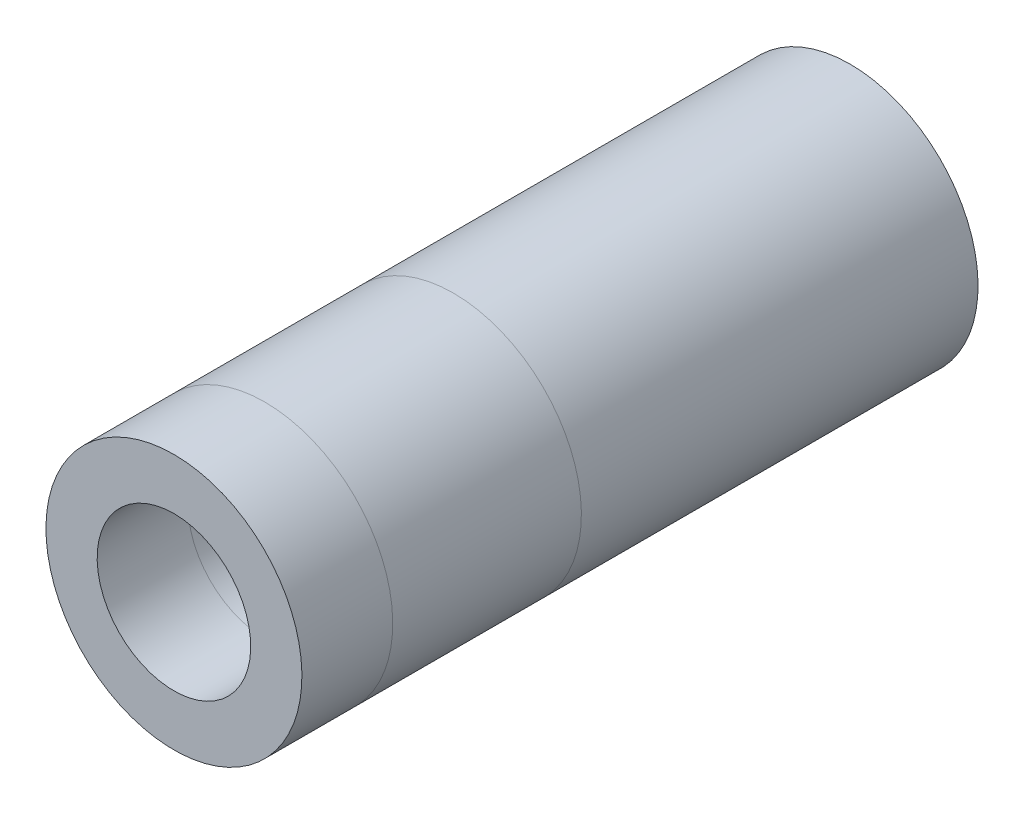
ISO-10303-21;
HEADER;
FILE_DESCRIPTION(('STEP AP214'),'2;1');
FILE_NAME('part.step','',(''),(''),'','','');
FILE_SCHEMA(('AUTOMOTIVE_DESIGN { 1 0 10303 214 1 1 1 1 }'));
ENDSEC;
DATA;
#1=APPLICATION_CONTEXT('core data for automotive mechanical design processes');
#2=APPLICATION_PROTOCOL_DEFINITION('international standard','automotive_design',2000,#1);
#3=PRODUCT_CONTEXT('',#1,'mechanical');
#4=PRODUCT('Part','Part','',(#3));
#5=PRODUCT_RELATED_PRODUCT_CATEGORY('part','',(#4));
#6=PRODUCT_DEFINITION_FORMATION('','',#4);
#7=PRODUCT_DEFINITION_CONTEXT('part definition',#1,'design');
#8=PRODUCT_DEFINITION('design','',#6,#7);
#9=PRODUCT_DEFINITION_SHAPE('','',#8);
#10=(LENGTH_UNIT() NAMED_UNIT(*) SI_UNIT(.MILLI.,.METRE.));
#11=(NAMED_UNIT(*) PLANE_ANGLE_UNIT() SI_UNIT($,.RADIAN.));
#12=(NAMED_UNIT(*) SI_UNIT($,.STERADIAN.) SOLID_ANGLE_UNIT());
#13=UNCERTAINTY_MEASURE_WITH_UNIT(LENGTH_MEASURE(1.E-05),#10,'distance_accuracy_value','');
#14=(GEOMETRIC_REPRESENTATION_CONTEXT(3) GLOBAL_UNCERTAINTY_ASSIGNED_CONTEXT((#13)) GLOBAL_UNIT_ASSIGNED_CONTEXT((#10,
#11,#12)) REPRESENTATION_CONTEXT('',''));
#15=CARTESIAN_POINT('',(0.,0.,0.));
#16=DIRECTION('',(0.,0.,1.));
#17=DIRECTION('',(1.,0.,0.));
#18=AXIS2_PLACEMENT_3D('',#15,#16,#17);
#19=CARTESIAN_POINT('',(-46.0299999999963,-4.10810718776133E-12,17.3334913680027));
#20=DIRECTION('',(-6.49576574405852E-13,7.29378281442687E-13,-1.));
#21=DIRECTION('',(0.,1.,7.29378281442687E-13));
#22=AXIS2_PLACEMENT_3D('',#19,#20,#21);
#23=PLANE('',#22);
#24=CARTESIAN_POINT('',(-46.0299999999963,-4.10810718776132E-12,17.3334913680027));
#25=DIRECTION('',(-6.49576574405852E-13,7.29378281442687E-13,-1.));
#26=DIRECTION('',(0.,1.,7.29378281442687E-13));
#27=AXIS2_PLACEMENT_3D('',#24,#25,#26);
#28=CIRCLE('',#27,4.7625);
#29=CARTESIAN_POINT('',(-46.0299999999963,4.7624999999959,17.3334913680062));
#30=VERTEX_POINT('',#29);
#31=EDGE_CURVE('E85',#30,#30,#28,.F.);
#32=ORIENTED_EDGE('',*,*,#31,.F.);
#33=EDGE_LOOP('',(#32));
#34=FACE_BOUND('',#33,.T.);
#35=CARTESIAN_POINT('',(-46.0299999999963,-4.10810718776133E-12,17.3334913680027));
#36=DIRECTION('',(-6.49576574405852E-13,7.29378281442687E-13,-1.));
#37=DIRECTION('',(0.,1.,7.29378281442687E-13));
#38=AXIS2_PLACEMENT_3D('',#35,#36,#37);
#39=CIRCLE('',#38,7.9375);
#40=CARTESIAN_POINT('',(-46.0299999999963,7.93749999999589,17.3334913680085));
#41=VERTEX_POINT('',#40);
#42=EDGE_CURVE('E79',#41,#41,#39,.T.);
#43=ORIENTED_EDGE('',*,*,#42,.F.);
#44=EDGE_LOOP('',(#43));
#45=FACE_BOUND('',#44,.T.);
#46=ADVANCED_FACE('F60',(#34,#45),#23,.F.);
#47=CARTESIAN_POINT('',(-46.0299999999888,-1.26418673307645E-11,-24.5999999999702));
#48=DIRECTION('',(-6.49576574405852E-13,7.29378281442687E-13,-1.));
#49=DIRECTION('',(0.,1.,7.29378281442687E-13));
#50=AXIS2_PLACEMENT_3D('',#47,#48,#49);
#51=PLANE('',#50);
#52=CARTESIAN_POINT('',(-46.0299999999888,-1.26418673307645E-11,-24.5999999999702));
#53=DIRECTION('',(-6.49576574405852E-13,7.29378281442687E-13,-1.));
#54=DIRECTION('',(0.,1.,7.29378281442687E-13));
#55=AXIS2_PLACEMENT_3D('',#52,#53,#54);
#56=CIRCLE('',#55,4.7625);
#57=CARTESIAN_POINT('',(-46.0299999999888,4.76249999998736,-24.5999999999667));
#58=VERTEX_POINT('',#57);
#59=EDGE_CURVE('E86',#58,#58,#56,.F.);
#60=ORIENTED_EDGE('',*,*,#59,.T.);
#61=EDGE_LOOP('',(#60));
#62=FACE_BOUND('',#61,.T.);
#63=CARTESIAN_POINT('',(-46.0299999999888,-1.26418673307645E-11,-24.5999999999702));
#64=DIRECTION('',(-6.49576574405852E-13,7.29378281442687E-13,-1.));
#65=DIRECTION('',(0.,1.,7.29378281442687E-13));
#66=AXIS2_PLACEMENT_3D('',#63,#64,#65);
#67=CIRCLE('',#66,7.9375);
#68=CARTESIAN_POINT('',(-46.0299999999888,7.93749999998736,-24.5999999999644));
#69=VERTEX_POINT('',#68);
#70=EDGE_CURVE('E11',#69,#69,#67,.T.);
#71=ORIENTED_EDGE('',*,*,#70,.T.);
#72=EDGE_LOOP('',(#71));
#73=FACE_BOUND('',#72,.T.);
#74=ADVANCED_FACE('F108',(#62,#73),#51,.T.);
#75=CARTESIAN_POINT('',(-46.0299999999963,-4.10810718776133E-12,17.3334913680027));
#76=DIRECTION('',(-6.45427582313838E-13,7.29378281442687E-13,-1.));
#77=DIRECTION('',(0.,1.,7.29378281442687E-13));
#78=AXIS2_PLACEMENT_3D('',#75,#76,#77);
#79=CYLINDRICAL_SURFACE('',#78,7.9375);
#80=CARTESIAN_POINT('',(-46.03,0.,11.7000469580001));
#81=DIRECTION('',(-6.49576574405852E-13,7.29378281442687E-13,-1.));
#82=DIRECTION('',(0.,1.,7.29378281442687E-13));
#83=AXIS2_PLACEMENT_3D('',#80,#81,#82);
#84=CIRCLE('',#83,7.9375);
#85=CARTESIAN_POINT('',(-46.03,7.9375,11.7000469580059));
#86=VERTEX_POINT('',#85);
#87=EDGE_CURVE('E73',#86,#86,#84,.T.);
#88=ORIENTED_EDGE('',*,*,#87,.F.);
#89=EDGE_LOOP('',(#88));
#90=FACE_BOUND('',#89,.T.);
#91=ORIENTED_EDGE('',*,*,#42,.T.);
#92=EDGE_LOOP('',(#91));
#93=FACE_BOUND('',#92,.T.);
#94=ADVANCED_FACE('F112',(#90,#93),#79,.T.);
#95=CARTESIAN_POINT('',(-46.0299999999888,-1.26418673307645E-11,11.7000469580298));
#96=DIRECTION('',(0.,0.,-1.));
#97=DIRECTION('',(0.,1.,0.));
#98=AXIS2_PLACEMENT_3D('',#95,#96,#97);
#99=CYLINDRICAL_SURFACE('',#98,7.9375);
#100=CARTESIAN_POINT('',(-46.0299999999888,-1.26418673307645E-11,2.65933108867245E-11));
#101=DIRECTION('',(-6.49576574405852E-13,7.29378281442687E-13,-1.));
#102=DIRECTION('',(0.,1.,7.29378281442687E-13));
#103=AXIS2_PLACEMENT_3D('',#100,#101,#102);
#104=CIRCLE('',#103,7.9375);
#105=CARTESIAN_POINT('',(-46.0299999999888,7.93749999998736,3.23827509956758E-11));
#106=VERTEX_POINT('',#105);
#107=EDGE_CURVE('E67',#106,#106,#104,.T.);
#108=ORIENTED_EDGE('',*,*,#107,.F.);
#109=EDGE_LOOP('',(#108));
#110=FACE_BOUND('',#109,.T.);
#111=ORIENTED_EDGE('',*,*,#87,.T.);
#112=EDGE_LOOP('',(#111));
#113=FACE_BOUND('',#112,.T.);
#114=ADVANCED_FACE('F114',(#110,#113),#99,.T.);
#115=CARTESIAN_POINT('',(-46.0299999999888,-1.26418673307645E-11,2.65794330989166E-11));
#116=DIRECTION('',(0.,0.,-1.));
#117=DIRECTION('',(-1.,0.,0.));
#118=AXIS2_PLACEMENT_3D('',#115,#116,#117);
#119=CYLINDRICAL_SURFACE('',#118,7.9375);
#120=ORIENTED_EDGE('',*,*,#70,.F.);
#121=EDGE_LOOP('',(#120));
#122=FACE_BOUND('',#121,.T.);
#123=ORIENTED_EDGE('',*,*,#107,.T.);
#124=EDGE_LOOP('',(#123));
#125=FACE_BOUND('',#124,.T.);
#126=ADVANCED_FACE('F121',(#122,#125),#119,.T.);
#127=CARTESIAN_POINT('',(-46.0299999999888,-1.26418673307645E-11,2.65898414397725E-11));
#128=DIRECTION('',(0.,0.,-1.));
#129=DIRECTION('',(-1.,0.,0.));
#130=AXIS2_PLACEMENT_3D('',#127,#128,#129);
#131=CYLINDRICAL_SURFACE('',#130,4.7625);
#132=CARTESIAN_POINT('',(-46.0299999999888,-1.26418673307645E-11,2.65898414397725E-11));
#133=DIRECTION('',(-6.49576574405852E-13,7.29378281442687E-13,-1.));
#134=DIRECTION('',(0.,1.,7.29378281442687E-13));
#135=AXIS2_PLACEMENT_3D('',#132,#133,#134);
#136=CIRCLE('',#135,4.7625);
#137=CARTESIAN_POINT('',(-46.0299999999888,4.76249999998736,3.00635055051433E-11));
#138=VERTEX_POINT('',#137);
#139=EDGE_CURVE('E91',#138,#138,#136,.T.);
#140=ORIENTED_EDGE('',*,*,#139,.F.);
#141=EDGE_LOOP('',(#140));
#142=FACE_BOUND('',#141,.T.);
#143=ORIENTED_EDGE('',*,*,#59,.F.);
#144=EDGE_LOOP('',(#143));
#145=FACE_BOUND('',#144,.T.);
#146=ADVANCED_FACE('F109',(#142,#145),#131,.F.);
#147=CARTESIAN_POINT('',(-46.0299999999957,-4.837485469204E-12,18.3334913680027));
#148=DIRECTION('',(-6.45410931951879E-13,7.29378281442687E-13,-1.));
#149=DIRECTION('',(0.,1.,7.29378281442687E-13));
#150=AXIS2_PLACEMENT_3D('',#147,#148,#149);
#151=CYLINDRICAL_SURFACE('',#150,4.7625);
#152=ORIENTED_EDGE('',*,*,#31,.T.);
#153=EDGE_LOOP('',(#152));
#154=FACE_BOUND('',#153,.T.);
#155=CARTESIAN_POINT('',(-46.03,0.,11.700046958));
#156=DIRECTION('',(-6.49576574405852E-13,7.29378281442687E-13,-1.));
#157=DIRECTION('',(0.,1.,7.29378281442687E-13));
#158=AXIS2_PLACEMENT_3D('',#155,#156,#157);
#159=CIRCLE('',#158,4.7625);
#160=CARTESIAN_POINT('',(-46.03,4.7625,11.7000469580035));
#161=VERTEX_POINT('',#160);
#162=EDGE_CURVE('E90',#161,#161,#159,.T.);
#163=ORIENTED_EDGE('',*,*,#162,.T.);
#164=EDGE_LOOP('',(#163));
#165=FACE_BOUND('',#164,.T.);
#166=ADVANCED_FACE('F103',(#154,#165),#151,.F.);
#167=CARTESIAN_POINT('',(-46.0299999999888,-1.26418673307645E-11,11.7000469580298));
#168=DIRECTION('',(0.,0.,-1.));
#169=DIRECTION('',(0.,1.,0.));
#170=AXIS2_PLACEMENT_3D('',#167,#168,#169);
#171=CYLINDRICAL_SURFACE('',#170,4.7625);
#172=ORIENTED_EDGE('',*,*,#139,.T.);
#173=EDGE_LOOP('',(#172));
#174=FACE_BOUND('',#173,.T.);
#175=ORIENTED_EDGE('',*,*,#162,.F.);
#176=EDGE_LOOP('',(#175));
#177=FACE_BOUND('',#176,.T.);
#178=ADVANCED_FACE('F134',(#174,#177),#171,.F.);
#179=CLOSED_SHELL('',(#46,#74,#94,#114,#126,#146,#166,#178));
#180=MANIFOLD_SOLID_BREP('B2',#179);
#181=ADVANCED_BREP_SHAPE_REPRESENTATION('',(#18,#180),#14);
#182=SHAPE_DEFINITION_REPRESENTATION(#9,#181);
ENDSEC;
END-ISO-10303-21;
